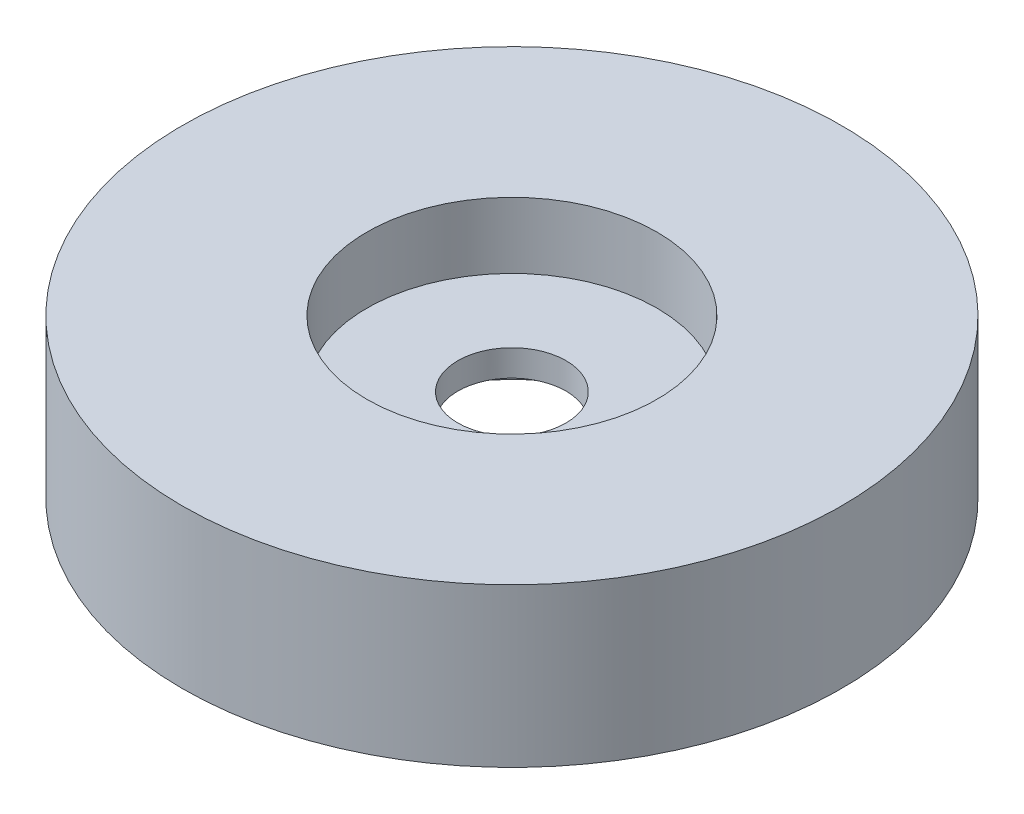
ISO-10303-21;
HEADER;
FILE_DESCRIPTION(('STEP AP214'),'2;1');
FILE_NAME('part.step','',(''),(''),'','','');
FILE_SCHEMA(('AUTOMOTIVE_DESIGN { 1 0 10303 214 1 1 1 1 }'));
ENDSEC;
DATA;
#1=APPLICATION_CONTEXT('core data for automotive mechanical design processes');
#2=APPLICATION_PROTOCOL_DEFINITION('international standard','automotive_design',2000,#1);
#3=PRODUCT_CONTEXT('',#1,'mechanical');
#4=PRODUCT('Part','Part','',(#3));
#5=PRODUCT_RELATED_PRODUCT_CATEGORY('part','',(#4));
#6=PRODUCT_DEFINITION_FORMATION('','',#4);
#7=PRODUCT_DEFINITION_CONTEXT('part definition',#1,'design');
#8=PRODUCT_DEFINITION('design','',#6,#7);
#9=PRODUCT_DEFINITION_SHAPE('','',#8);
#10=(LENGTH_UNIT() NAMED_UNIT(*) SI_UNIT(.MILLI.,.METRE.));
#11=(NAMED_UNIT(*) PLANE_ANGLE_UNIT() SI_UNIT($,.RADIAN.));
#12=(NAMED_UNIT(*) SI_UNIT($,.STERADIAN.) SOLID_ANGLE_UNIT());
#13=UNCERTAINTY_MEASURE_WITH_UNIT(LENGTH_MEASURE(1.E-05),#10,'distance_accuracy_value','');
#14=(GEOMETRIC_REPRESENTATION_CONTEXT(3) GLOBAL_UNCERTAINTY_ASSIGNED_CONTEXT((#13)) GLOBAL_UNIT_ASSIGNED_CONTEXT((#10,
#11,#12)) REPRESENTATION_CONTEXT('',''));
#15=CARTESIAN_POINT('',(0.,0.,0.));
#16=DIRECTION('',(0.,0.,1.));
#17=DIRECTION('',(1.,0.,0.));
#18=AXIS2_PLACEMENT_3D('',#15,#16,#17);
#19=CARTESIAN_POINT('',(0.,12.,0.));
#20=DIRECTION('',(0.,-1.,0.));
#21=DIRECTION('',(0.,0.,-1.));
#22=AXIS2_PLACEMENT_3D('',#19,#20,#21);
#23=CYLINDRICAL_SURFACE('',#22,4.1);
#24=CARTESIAN_POINT('',(0.,7.,0.));
#25=DIRECTION('',(0.,1.,0.));
#26=DIRECTION('',(0.,0.,1.));
#27=AXIS2_PLACEMENT_3D('',#24,#25,#26);
#28=CIRCLE('',#27,4.1);
#29=CARTESIAN_POINT('',(0.,7.,4.1));
#30=VERTEX_POINT('',#29);
#31=EDGE_CURVE('E44',#30,#30,#28,.T.);
#32=ORIENTED_EDGE('',*,*,#31,.T.);
#33=EDGE_LOOP('',(#32));
#34=FACE_BOUND('',#33,.T.);
#35=CARTESIAN_POINT('',(0.,5.,0.));
#36=DIRECTION('',(0.,-1.,0.));
#37=DIRECTION('',(0.,0.,-1.));
#38=AXIS2_PLACEMENT_3D('',#35,#36,#37);
#39=CIRCLE('',#38,4.1);
#40=CARTESIAN_POINT('',(0.,5.,-4.1));
#41=VERTEX_POINT('',#40);
#42=EDGE_CURVE('E35',#41,#41,#39,.T.);
#43=ORIENTED_EDGE('',*,*,#42,.T.);
#44=EDGE_LOOP('',(#43));
#45=FACE_BOUND('',#44,.T.);
#46=ADVANCED_FACE('F31',(#34,#45),#23,.F.);
#47=CARTESIAN_POINT('',(0.,12.,0.));
#48=DIRECTION('',(0.,1.,0.));
#49=DIRECTION('',(0.,0.,1.));
#50=AXIS2_PLACEMENT_3D('',#47,#48,#49);
#51=PLANE('',#50);
#52=CARTESIAN_POINT('',(0.,12.,0.));
#53=DIRECTION('',(0.,1.,0.));
#54=DIRECTION('',(0.,0.,1.));
#55=AXIS2_PLACEMENT_3D('',#52,#53,#54);
#56=CIRCLE('',#55,11.);
#57=CARTESIAN_POINT('',(0.,12.,11.));
#58=VERTEX_POINT('',#57);
#59=EDGE_CURVE('E47',#58,#58,#56,.T.);
#60=ORIENTED_EDGE('',*,*,#59,.F.);
#61=EDGE_LOOP('',(#60));
#62=FACE_BOUND('',#61,.T.);
#63=CARTESIAN_POINT('',(0.,12.,0.));
#64=DIRECTION('',(0.,1.,0.));
#65=DIRECTION('',(0.,0.,1.));
#66=AXIS2_PLACEMENT_3D('',#63,#64,#65);
#67=CIRCLE('',#66,25.);
#68=CARTESIAN_POINT('',(0.,12.,25.));
#69=VERTEX_POINT('',#68);
#70=EDGE_CURVE('E10',#69,#69,#67,.T.);
#71=ORIENTED_EDGE('',*,*,#70,.T.);
#72=EDGE_LOOP('',(#71));
#73=FACE_BOUND('',#72,.T.);
#74=ADVANCED_FACE('F80',(#62,#73),#51,.T.);
#75=CARTESIAN_POINT('',(0.,0.,0.));
#76=DIRECTION('',(0.,1.,0.));
#77=DIRECTION('',(0.,0.,1.));
#78=AXIS2_PLACEMENT_3D('',#75,#76,#77);
#79=PLANE('',#78);
#80=CARTESIAN_POINT('',(0.,0.,0.));
#81=DIRECTION('',(0.,-1.,0.));
#82=DIRECTION('',(0.,0.,-1.));
#83=AXIS2_PLACEMENT_3D('',#80,#81,#82);
#84=CIRCLE('',#83,11.05);
#85=CARTESIAN_POINT('',(0.,0.,-11.05));
#86=VERTEX_POINT('',#85);
#87=EDGE_CURVE('E58',#86,#86,#84,.T.);
#88=ORIENTED_EDGE('',*,*,#87,.F.);
#89=EDGE_LOOP('',(#88));
#90=FACE_BOUND('',#89,.T.);
#91=CARTESIAN_POINT('',(0.,0.,0.));
#92=DIRECTION('',(0.,1.,0.));
#93=DIRECTION('',(0.,0.,1.));
#94=AXIS2_PLACEMENT_3D('',#91,#92,#93);
#95=CIRCLE('',#94,25.);
#96=CARTESIAN_POINT('',(0.,0.,25.));
#97=VERTEX_POINT('',#96);
#98=EDGE_CURVE('E39',#97,#97,#95,.T.);
#99=ORIENTED_EDGE('',*,*,#98,.F.);
#100=EDGE_LOOP('',(#99));
#101=FACE_BOUND('',#100,.T.);
#102=ADVANCED_FACE('F85',(#90,#101),#79,.F.);
#103=CARTESIAN_POINT('',(0.,12.,0.));
#104=DIRECTION('',(0.,-1.,0.));
#105=DIRECTION('',(0.,0.,-1.));
#106=AXIS2_PLACEMENT_3D('',#103,#104,#105);
#107=CYLINDRICAL_SURFACE('',#106,25.);
#108=ORIENTED_EDGE('',*,*,#70,.F.);
#109=EDGE_LOOP('',(#108));
#110=FACE_BOUND('',#109,.T.);
#111=ORIENTED_EDGE('',*,*,#98,.T.);
#112=EDGE_LOOP('',(#111));
#113=FACE_BOUND('',#112,.T.);
#114=ADVANCED_FACE('F33',(#110,#113),#107,.T.);
#115=CARTESIAN_POINT('',(0.,7.,0.));
#116=DIRECTION('',(0.,1.,0.));
#117=DIRECTION('',(0.,0.,1.));
#118=AXIS2_PLACEMENT_3D('',#115,#116,#117);
#119=CYLINDRICAL_SURFACE('',#118,11.);
#120=CARTESIAN_POINT('',(0.,7.,0.));
#121=DIRECTION('',(0.,1.,0.));
#122=DIRECTION('',(0.,0.,1.));
#123=AXIS2_PLACEMENT_3D('',#120,#121,#122);
#124=CIRCLE('',#123,11.);
#125=CARTESIAN_POINT('',(0.,7.,11.));
#126=VERTEX_POINT('',#125);
#127=EDGE_CURVE('E50',#126,#126,#124,.T.);
#128=ORIENTED_EDGE('',*,*,#127,.F.);
#129=EDGE_LOOP('',(#128));
#130=FACE_BOUND('',#129,.T.);
#131=ORIENTED_EDGE('',*,*,#59,.T.);
#132=EDGE_LOOP('',(#131));
#133=FACE_BOUND('',#132,.T.);
#134=ADVANCED_FACE('F89',(#130,#133),#119,.F.);
#135=CARTESIAN_POINT('',(0.,7.,0.));
#136=DIRECTION('',(0.,1.,0.));
#137=DIRECTION('',(0.,0.,1.));
#138=AXIS2_PLACEMENT_3D('',#135,#136,#137);
#139=PLANE('',#138);
#140=ORIENTED_EDGE('',*,*,#31,.F.);
#141=EDGE_LOOP('',(#140));
#142=FACE_BOUND('',#141,.T.);
#143=ORIENTED_EDGE('',*,*,#127,.T.);
#144=EDGE_LOOP('',(#143));
#145=FACE_BOUND('',#144,.T.);
#146=ADVANCED_FACE('F76',(#142,#145),#139,.T.);
#147=CARTESIAN_POINT('',(0.,5.,0.));
#148=DIRECTION('',(0.,-1.,0.));
#149=DIRECTION('',(0.,0.,-1.));
#150=AXIS2_PLACEMENT_3D('',#147,#148,#149);
#151=CYLINDRICAL_SURFACE('',#150,11.05);
#152=CARTESIAN_POINT('',(0.,5.,0.));
#153=DIRECTION('',(0.,-1.,0.));
#154=DIRECTION('',(0.,0.,-1.));
#155=AXIS2_PLACEMENT_3D('',#152,#153,#154);
#156=CIRCLE('',#155,11.05);
#157=CARTESIAN_POINT('',(0.,5.,-11.05));
#158=VERTEX_POINT('',#157);
#159=EDGE_CURVE('E61',#158,#158,#156,.T.);
#160=ORIENTED_EDGE('',*,*,#159,.F.);
#161=EDGE_LOOP('',(#160));
#162=FACE_BOUND('',#161,.T.);
#163=ORIENTED_EDGE('',*,*,#87,.T.);
#164=EDGE_LOOP('',(#163));
#165=FACE_BOUND('',#164,.T.);
#166=ADVANCED_FACE('F71',(#162,#165),#151,.F.);
#167=CARTESIAN_POINT('',(0.,5.,0.));
#168=DIRECTION('',(0.,-1.,0.));
#169=DIRECTION('',(0.,0.,-1.));
#170=AXIS2_PLACEMENT_3D('',#167,#168,#169);
#171=PLANE('',#170);
#172=ORIENTED_EDGE('',*,*,#42,.F.);
#173=EDGE_LOOP('',(#172));
#174=FACE_BOUND('',#173,.T.);
#175=ORIENTED_EDGE('',*,*,#159,.T.);
#176=EDGE_LOOP('',(#175));
#177=FACE_BOUND('',#176,.T.);
#178=ADVANCED_FACE('F69',(#174,#177),#171,.T.);
#179=CLOSED_SHELL('',(#46,#74,#102,#114,#134,#146,#166,#178));
#180=MANIFOLD_SOLID_BREP('B2',#179);
#181=ADVANCED_BREP_SHAPE_REPRESENTATION('',(#18,#180),#14);
#182=SHAPE_DEFINITION_REPRESENTATION(#9,#181);
ENDSEC;
END-ISO-10303-21;
